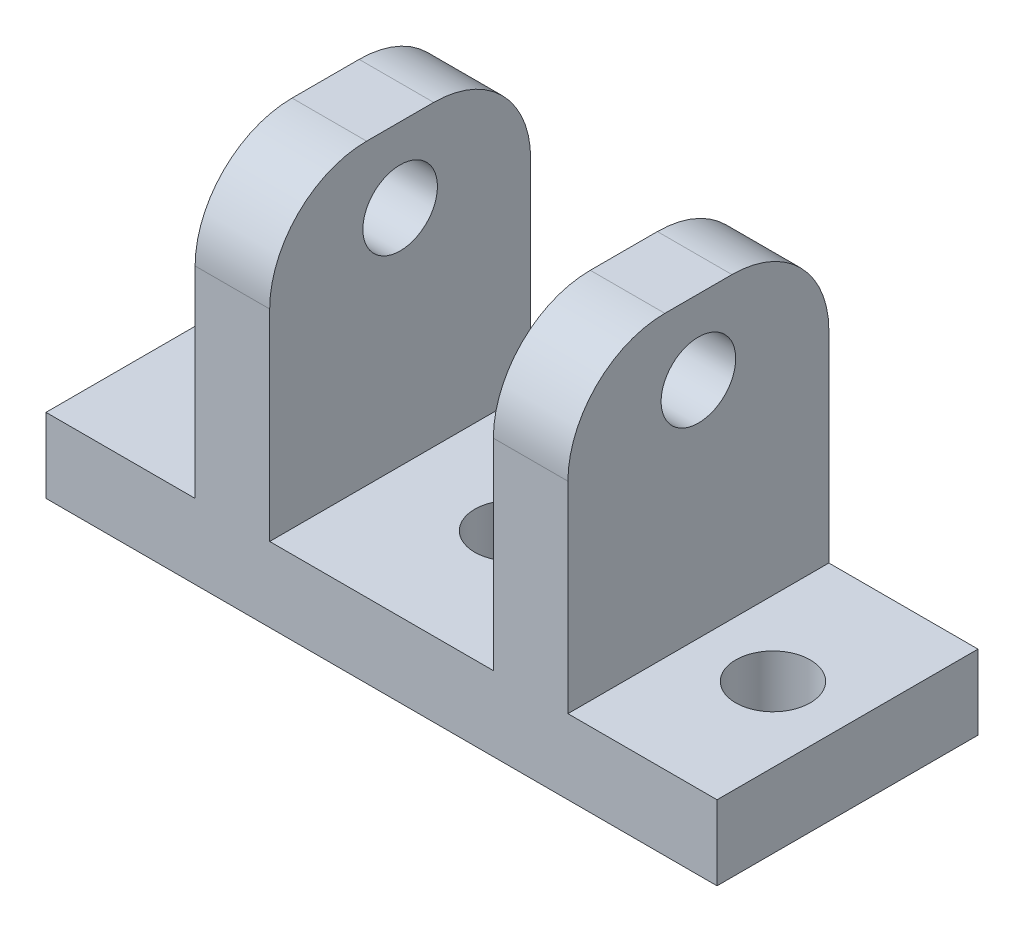
ISO-10303-21;
HEADER;
FILE_DESCRIPTION(('STEP AP214'),'2;1');
FILE_NAME('part.step','',(''),(''),'','','');
FILE_SCHEMA(('AUTOMOTIVE_DESIGN { 1 0 10303 214 1 1 1 1 }'));
ENDSEC;
DATA;
#1=APPLICATION_CONTEXT('core data for automotive mechanical design processes');
#2=APPLICATION_PROTOCOL_DEFINITION('international standard','automotive_design',2000,#1);
#3=PRODUCT_CONTEXT('',#1,'mechanical');
#4=PRODUCT('Part','Part','',(#3));
#5=PRODUCT_RELATED_PRODUCT_CATEGORY('part','',(#4));
#6=PRODUCT_DEFINITION_FORMATION('','',#4);
#7=PRODUCT_DEFINITION_CONTEXT('part definition',#1,'design');
#8=PRODUCT_DEFINITION('design','',#6,#7);
#9=PRODUCT_DEFINITION_SHAPE('','',#8);
#10=(LENGTH_UNIT() NAMED_UNIT(*) SI_UNIT(.MILLI.,.METRE.));
#11=(NAMED_UNIT(*) PLANE_ANGLE_UNIT() SI_UNIT($,.RADIAN.));
#12=(NAMED_UNIT(*) SI_UNIT($,.STERADIAN.) SOLID_ANGLE_UNIT());
#13=UNCERTAINTY_MEASURE_WITH_UNIT(LENGTH_MEASURE(1.E-05),#10,'distance_accuracy_value','');
#14=(GEOMETRIC_REPRESENTATION_CONTEXT(3) GLOBAL_UNCERTAINTY_ASSIGNED_CONTEXT((#13)) GLOBAL_UNIT_ASSIGNED_CONTEXT((#10,
#11,#12)) REPRESENTATION_CONTEXT('',''));
#15=CARTESIAN_POINT('',(0.,0.,0.));
#16=DIRECTION('',(0.,0.,1.));
#17=DIRECTION('',(1.,0.,0.));
#18=AXIS2_PLACEMENT_3D('',#15,#16,#17);
#19=CARTESIAN_POINT('',(0.,6.35,-22.225));
#20=DIRECTION('',(0.,0.,-1.));
#21=DIRECTION('',(-1.,0.,0.));
#22=AXIS2_PLACEMENT_3D('',#19,#20,#21);
#23=PLANE('',#22);
#24=DIRECTION('',(0.,-1.,0.));
#25=VECTOR('',#24,1.);
#26=CARTESIAN_POINT('',(12.7,31.75,-22.225));
#27=LINE('',#26,#25);
#28=CARTESIAN_POINT('',(12.7,23.495,-22.225));
#29=VERTEX_POINT('',#28);
#30=CARTESIAN_POINT('',(12.7,6.35,-22.225));
#31=VERTEX_POINT('',#30);
#32=EDGE_CURVE('E199',#29,#31,#27,.T.);
#33=ORIENTED_EDGE('',*,*,#32,.F.);
#34=DIRECTION('',(1.,0.,0.));
#35=VECTOR('',#34,1.);
#36=CARTESIAN_POINT('',(0.,23.495,-22.225));
#37=LINE('',#36,#35);
#38=CARTESIAN_POINT('',(19.05,23.495,-22.225));
#39=VERTEX_POINT('',#38);
#40=EDGE_CURVE('E260',#29,#39,#37,.T.);
#41=ORIENTED_EDGE('',*,*,#40,.T.);
#42=DIRECTION('',(0.,-1.,0.));
#43=VECTOR('',#42,1.);
#44=CARTESIAN_POINT('',(19.05,31.75,-22.225));
#45=LINE('',#44,#43);
#46=CARTESIAN_POINT('',(19.05,6.35,-22.225));
#47=VERTEX_POINT('',#46);
#48=EDGE_CURVE('E202',#39,#47,#45,.T.);
#49=ORIENTED_EDGE('',*,*,#48,.T.);
#50=DIRECTION('',(1.,0.,0.));
#51=VECTOR('',#50,1.);
#52=CARTESIAN_POINT('',(0.,6.35,-22.225));
#53=LINE('',#52,#51);
#54=CARTESIAN_POINT('',(38.1,6.35,-22.225));
#55=VERTEX_POINT('',#54);
#56=EDGE_CURVE('E243',#47,#55,#53,.T.);
#57=ORIENTED_EDGE('',*,*,#56,.T.);
#58=DIRECTION('',(0.,-1.,0.));
#59=VECTOR('',#58,1.);
#60=CARTESIAN_POINT('',(38.1,31.75,-22.225));
#61=LINE('',#60,#59);
#62=CARTESIAN_POINT('',(38.1,23.495,-22.225));
#63=VERTEX_POINT('',#62);
#64=EDGE_CURVE('E288',#63,#55,#61,.T.);
#65=ORIENTED_EDGE('',*,*,#64,.F.);
#66=DIRECTION('',(1.,0.,0.));
#67=VECTOR('',#66,1.);
#68=CARTESIAN_POINT('',(0.,23.495,-22.225));
#69=LINE('',#68,#67);
#70=CARTESIAN_POINT('',(44.45,23.495,-22.225));
#71=VERTEX_POINT('',#70);
#72=EDGE_CURVE('E321',#63,#71,#69,.T.);
#73=ORIENTED_EDGE('',*,*,#72,.T.);
#74=DIRECTION('',(0.,-1.,0.));
#75=VECTOR('',#74,1.);
#76=CARTESIAN_POINT('',(44.45,31.75,-22.225));
#77=LINE('',#76,#75);
#78=CARTESIAN_POINT('',(44.45,6.35,-22.225));
#79=VERTEX_POINT('',#78);
#80=EDGE_CURVE('E326',#71,#79,#77,.T.);
#81=ORIENTED_EDGE('',*,*,#80,.T.);
#82=DIRECTION('',(1.,0.,0.));
#83=VECTOR('',#82,1.);
#84=CARTESIAN_POINT('',(0.,6.35,-22.225));
#85=LINE('',#84,#83);
#86=CARTESIAN_POINT('',(57.15,6.35,-22.225));
#87=VERTEX_POINT('',#86);
#88=EDGE_CURVE('E166',#79,#87,#85,.T.);
#89=ORIENTED_EDGE('',*,*,#88,.T.);
#90=DIRECTION('',(0.,-1.,0.));
#91=VECTOR('',#90,1.);
#92=CARTESIAN_POINT('',(57.15,6.35,-22.225));
#93=LINE('',#92,#91);
#94=CARTESIAN_POINT('',(57.15,0.,-22.225));
#95=VERTEX_POINT('',#94);
#96=EDGE_CURVE('E174',#87,#95,#93,.T.);
#97=ORIENTED_EDGE('',*,*,#96,.T.);
#98=DIRECTION('',(1.,0.,0.));
#99=VECTOR('',#98,1.);
#100=CARTESIAN_POINT('',(0.,0.,-22.225));
#101=LINE('',#100,#99);
#102=CARTESIAN_POINT('',(0.,0.,-22.225));
#103=VERTEX_POINT('',#102);
#104=EDGE_CURVE('E219',#103,#95,#101,.T.);
#105=ORIENTED_EDGE('',*,*,#104,.F.);
#106=DIRECTION('',(0.,-1.,0.));
#107=VECTOR('',#106,1.);
#108=CARTESIAN_POINT('',(0.,6.35,-22.225));
#109=LINE('',#108,#107);
#110=CARTESIAN_POINT('',(0.,6.35,-22.225));
#111=VERTEX_POINT('',#110);
#112=EDGE_CURVE('E227',#111,#103,#109,.T.);
#113=ORIENTED_EDGE('',*,*,#112,.F.);
#114=DIRECTION('',(1.,0.,0.));
#115=VECTOR('',#114,1.);
#116=CARTESIAN_POINT('',(0.,6.35,-22.225));
#117=LINE('',#116,#115);
#118=EDGE_CURVE('E216',#111,#31,#117,.T.);
#119=ORIENTED_EDGE('',*,*,#118,.T.);
#120=EDGE_LOOP('',(#33,#41,#49,#57,#65,#73,#81,#89,#97,#105,#113,#119));
#121=FACE_BOUND('',#120,.T.);
#122=ADVANCED_FACE('F37',(#121),#23,.T.);
#123=CARTESIAN_POINT('',(0.,6.35,0.));
#124=DIRECTION('',(-1.,0.,0.));
#125=DIRECTION('',(0.,0.,1.));
#126=AXIS2_PLACEMENT_3D('',#123,#124,#125);
#127=PLANE('',#126);
#128=DIRECTION('',(0.,0.,-1.));
#129=VECTOR('',#128,1.);
#130=CARTESIAN_POINT('',(0.,0.,0.));
#131=LINE('',#130,#129);
#132=CARTESIAN_POINT('',(0.,0.,0.));
#133=VERTEX_POINT('',#132);
#134=EDGE_CURVE('E442',#133,#103,#131,.T.);
#135=ORIENTED_EDGE('',*,*,#134,.F.);
#136=DIRECTION('',(0.,-1.,0.));
#137=VECTOR('',#136,1.);
#138=CARTESIAN_POINT('',(0.,6.35,0.));
#139=LINE('',#138,#137);
#140=CARTESIAN_POINT('',(0.,6.35,0.));
#141=VERTEX_POINT('',#140);
#142=EDGE_CURVE('E226',#141,#133,#139,.T.);
#143=ORIENTED_EDGE('',*,*,#142,.F.);
#144=DIRECTION('',(0.,0.,-1.));
#145=VECTOR('',#144,1.);
#146=CARTESIAN_POINT('',(0.,6.35,0.));
#147=LINE('',#146,#145);
#148=EDGE_CURVE('E212',#141,#111,#147,.T.);
#149=ORIENTED_EDGE('',*,*,#148,.T.);
#150=ORIENTED_EDGE('',*,*,#112,.T.);
#151=EDGE_LOOP('',(#135,#143,#149,#150));
#152=FACE_BOUND('',#151,.T.);
#153=ADVANCED_FACE('F363',(#152),#127,.T.);
#154=CARTESIAN_POINT('',(0.,6.35,0.));
#155=DIRECTION('',(0.,0.,-1.));
#156=DIRECTION('',(-1.,0.,0.));
#157=AXIS2_PLACEMENT_3D('',#154,#155,#156);
#158=PLANE('',#157);
#159=DIRECTION('',(0.,-1.,0.));
#160=VECTOR('',#159,1.);
#161=CARTESIAN_POINT('',(44.45,31.75,0.));
#162=LINE('',#161,#160);
#163=CARTESIAN_POINT('',(44.45,23.495,0.));
#164=VERTEX_POINT('',#163);
#165=CARTESIAN_POINT('',(44.45,6.35,0.));
#166=VERTEX_POINT('',#165);
#167=EDGE_CURVE('E149',#164,#166,#162,.T.);
#168=ORIENTED_EDGE('',*,*,#167,.F.);
#169=DIRECTION('',(1.,0.,0.));
#170=VECTOR('',#169,1.);
#171=CARTESIAN_POINT('',(38.1,23.495,0.));
#172=LINE('',#171,#170);
#173=CARTESIAN_POINT('',(38.1,23.495,0.));
#174=VERTEX_POINT('',#173);
#175=EDGE_CURVE('E11',#164,#174,#172,.F.);
#176=ORIENTED_EDGE('',*,*,#175,.T.);
#177=DIRECTION('',(0.,-1.,0.));
#178=VECTOR('',#177,1.);
#179=CARTESIAN_POINT('',(38.1,31.75,0.));
#180=LINE('',#179,#178);
#181=CARTESIAN_POINT('',(38.1,6.35,0.));
#182=VERTEX_POINT('',#181);
#183=EDGE_CURVE('E158',#174,#182,#180,.T.);
#184=ORIENTED_EDGE('',*,*,#183,.T.);
#185=DIRECTION('',(1.,0.,0.));
#186=VECTOR('',#185,1.);
#187=CARTESIAN_POINT('',(0.,6.35,0.));
#188=LINE('',#187,#186);
#189=CARTESIAN_POINT('',(19.05,6.35,0.));
#190=VERTEX_POINT('',#189);
#191=EDGE_CURVE('E242',#190,#182,#188,.T.);
#192=ORIENTED_EDGE('',*,*,#191,.F.);
#193=DIRECTION('',(0.,-1.,0.));
#194=VECTOR('',#193,1.);
#195=CARTESIAN_POINT('',(19.05,31.75,0.));
#196=LINE('',#195,#194);
#197=CARTESIAN_POINT('',(19.05,23.495,0.));
#198=VERTEX_POINT('',#197);
#199=EDGE_CURVE('E255',#198,#190,#196,.T.);
#200=ORIENTED_EDGE('',*,*,#199,.F.);
#201=DIRECTION('',(1.,0.,0.));
#202=VECTOR('',#201,1.);
#203=CARTESIAN_POINT('',(12.7,23.495,0.));
#204=LINE('',#203,#202);
#205=CARTESIAN_POINT('',(12.7,23.495,0.));
#206=VERTEX_POINT('',#205);
#207=EDGE_CURVE('E45',#198,#206,#204,.F.);
#208=ORIENTED_EDGE('',*,*,#207,.T.);
#209=DIRECTION('',(0.,-1.,0.));
#210=VECTOR('',#209,1.);
#211=CARTESIAN_POINT('',(12.7,31.75,0.));
#212=LINE('',#211,#210);
#213=CARTESIAN_POINT('',(12.7,6.35,0.));
#214=VERTEX_POINT('',#213);
#215=EDGE_CURVE('E203',#206,#214,#212,.T.);
#216=ORIENTED_EDGE('',*,*,#215,.T.);
#217=DIRECTION('',(1.,0.,0.));
#218=VECTOR('',#217,1.);
#219=CARTESIAN_POINT('',(0.,6.35,0.));
#220=LINE('',#219,#218);
#221=EDGE_CURVE('E215',#141,#214,#220,.T.);
#222=ORIENTED_EDGE('',*,*,#221,.F.);
#223=ORIENTED_EDGE('',*,*,#142,.T.);
#224=DIRECTION('',(1.,0.,0.));
#225=VECTOR('',#224,1.);
#226=CARTESIAN_POINT('',(0.,0.,0.));
#227=LINE('',#226,#225);
#228=CARTESIAN_POINT('',(57.15,0.,0.));
#229=VERTEX_POINT('',#228);
#230=EDGE_CURVE('E235',#133,#229,#227,.T.);
#231=ORIENTED_EDGE('',*,*,#230,.T.);
#232=DIRECTION('',(0.,-1.,0.));
#233=VECTOR('',#232,1.);
#234=CARTESIAN_POINT('',(57.15,6.35,0.));
#235=LINE('',#234,#233);
#236=CARTESIAN_POINT('',(57.15,6.35,0.));
#237=VERTEX_POINT('',#236);
#238=EDGE_CURVE('E170',#237,#229,#235,.T.);
#239=ORIENTED_EDGE('',*,*,#238,.F.);
#240=DIRECTION('',(1.,0.,0.));
#241=VECTOR('',#240,1.);
#242=CARTESIAN_POINT('',(0.,6.35,0.));
#243=LINE('',#242,#241);
#244=EDGE_CURVE('E163',#166,#237,#243,.T.);
#245=ORIENTED_EDGE('',*,*,#244,.F.);
#246=EDGE_LOOP('',(#168,#176,#184,#192,#200,#208,#216,#222,#223,#231,#239,#245));
#247=FACE_BOUND('',#246,.T.);
#248=ADVANCED_FACE('F168',(#247),#158,.F.);
#249=CARTESIAN_POINT('',(0.,6.35,0.));
#250=DIRECTION('',(0.,1.,0.));
#251=DIRECTION('',(0.,0.,1.));
#252=AXIS2_PLACEMENT_3D('',#249,#250,#251);
#253=PLANE('',#252);
#254=CARTESIAN_POINT('',(6.35,6.35,-11.1125));
#255=DIRECTION('',(0.,1.,0.));
#256=DIRECTION('',(0.,0.,1.));
#257=AXIS2_PLACEMENT_3D('',#254,#255,#256);
#258=CIRCLE('',#257,3.17499999999999);
#259=CARTESIAN_POINT('',(6.35,6.35,-7.93750000000001));
#260=VERTEX_POINT('',#259);
#261=EDGE_CURVE('E198',#260,#260,#258,.T.);
#262=ORIENTED_EDGE('',*,*,#261,.F.);
#263=EDGE_LOOP('',(#262));
#264=FACE_BOUND('',#263,.T.);
#265=ORIENTED_EDGE('',*,*,#118,.F.);
#266=ORIENTED_EDGE('',*,*,#148,.F.);
#267=ORIENTED_EDGE('',*,*,#221,.T.);
#268=DIRECTION('',(0.,0.,1.));
#269=VECTOR('',#268,1.);
#270=CARTESIAN_POINT('',(12.7,6.35,0.));
#271=LINE('',#270,#269);
#272=EDGE_CURVE('E222',#31,#214,#271,.T.);
#273=ORIENTED_EDGE('',*,*,#272,.F.);
#274=EDGE_LOOP('',(#265,#266,#267,#273));
#275=FACE_BOUND('',#274,.T.);
#276=ADVANCED_FACE('F373',(#264,#275),#253,.T.);
#277=CARTESIAN_POINT('',(0.,0.,0.));
#278=DIRECTION('',(0.,1.,0.));
#279=DIRECTION('',(0.,0.,1.));
#280=AXIS2_PLACEMENT_3D('',#277,#278,#279);
#281=PLANE('',#280);
#282=CARTESIAN_POINT('',(6.35,0.,-11.1125));
#283=DIRECTION('',(0.,1.,0.));
#284=DIRECTION('',(0.,0.,1.));
#285=AXIS2_PLACEMENT_3D('',#282,#283,#284);
#286=CIRCLE('',#285,3.17499999999999);
#287=CARTESIAN_POINT('',(6.35,0.,-7.93750000000001));
#288=VERTEX_POINT('',#287);
#289=EDGE_CURVE('E195',#288,#288,#286,.T.);
#290=ORIENTED_EDGE('',*,*,#289,.T.);
#291=EDGE_LOOP('',(#290));
#292=FACE_BOUND('',#291,.T.);
#293=CARTESIAN_POINT('',(28.575,0.,-11.1125));
#294=DIRECTION('',(0.,1.,0.));
#295=DIRECTION('',(0.,0.,1.));
#296=AXIS2_PLACEMENT_3D('',#293,#294,#295);
#297=CIRCLE('',#296,3.17499999999999);
#298=CARTESIAN_POINT('',(28.575,0.,-7.93750000000001));
#299=VERTEX_POINT('',#298);
#300=EDGE_CURVE('E190',#299,#299,#297,.T.);
#301=ORIENTED_EDGE('',*,*,#300,.T.);
#302=EDGE_LOOP('',(#301));
#303=FACE_BOUND('',#302,.T.);
#304=CARTESIAN_POINT('',(50.8,0.,-11.1125));
#305=DIRECTION('',(0.,1.,0.));
#306=DIRECTION('',(0.,0.,1.));
#307=AXIS2_PLACEMENT_3D('',#304,#305,#306);
#308=CIRCLE('',#307,3.17499999999999);
#309=CARTESIAN_POINT('',(50.8,0.,-7.93750000000001));
#310=VERTEX_POINT('',#309);
#311=EDGE_CURVE('E434',#310,#310,#308,.T.);
#312=ORIENTED_EDGE('',*,*,#311,.T.);
#313=EDGE_LOOP('',(#312));
#314=FACE_BOUND('',#313,.T.);
#315=ORIENTED_EDGE('',*,*,#104,.T.);
#316=DIRECTION('',(0.,0.,-1.));
#317=VECTOR('',#316,1.);
#318=CARTESIAN_POINT('',(57.15,0.,0.));
#319=LINE('',#318,#317);
#320=EDGE_CURVE('E182',#229,#95,#319,.T.);
#321=ORIENTED_EDGE('',*,*,#320,.F.);
#322=ORIENTED_EDGE('',*,*,#230,.F.);
#323=ORIENTED_EDGE('',*,*,#134,.T.);
#324=EDGE_LOOP('',(#315,#321,#322,#323));
#325=FACE_BOUND('',#324,.T.);
#326=ADVANCED_FACE('F374',(#292,#303,#314,#325),#281,.F.);
#327=CARTESIAN_POINT('',(12.7,31.75,0.));
#328=DIRECTION('',(1.,0.,0.));
#329=DIRECTION('',(0.,0.,-1.));
#330=AXIS2_PLACEMENT_3D('',#327,#328,#329);
#331=PLANE('',#330);
#332=CARTESIAN_POINT('',(12.7,25.4,-11.1125));
#333=DIRECTION('',(-1.,0.,0.));
#334=DIRECTION('',(0.,0.,1.));
#335=AXIS2_PLACEMENT_3D('',#332,#333,#334);
#336=CIRCLE('',#335,3.175);
#337=CARTESIAN_POINT('',(12.7,25.4,-7.9375));
#338=VERTEX_POINT('',#337);
#339=EDGE_CURVE('E189',#338,#338,#336,.T.);
#340=ORIENTED_EDGE('',*,*,#339,.F.);
#341=EDGE_LOOP('',(#340));
#342=FACE_BOUND('',#341,.T.);
#343=DIRECTION('',(0.,0.,1.));
#344=VECTOR('',#343,1.);
#345=CARTESIAN_POINT('',(12.7,31.75,0.));
#346=LINE('',#345,#344);
#347=CARTESIAN_POINT('',(12.7,31.75,-13.97));
#348=VERTEX_POINT('',#347);
#349=CARTESIAN_POINT('',(12.7,31.75,-8.255));
#350=VERTEX_POINT('',#349);
#351=EDGE_CURVE('E253',#348,#350,#346,.T.);
#352=ORIENTED_EDGE('',*,*,#351,.F.);
#353=CARTESIAN_POINT('',(12.7,23.495,-13.97));
#354=DIRECTION('',(1.,0.,0.));
#355=DIRECTION('',(0.,0.,-1.));
#356=AXIS2_PLACEMENT_3D('',#353,#354,#355);
#357=CIRCLE('',#356,8.255);
#358=EDGE_CURVE('E274',#348,#29,#357,.F.);
#359=ORIENTED_EDGE('',*,*,#358,.T.);
#360=ORIENTED_EDGE('',*,*,#32,.T.);
#361=ORIENTED_EDGE('',*,*,#272,.T.);
#362=ORIENTED_EDGE('',*,*,#215,.F.);
#363=CARTESIAN_POINT('',(12.7,23.495,-8.255));
#364=DIRECTION('',(1.,0.,0.));
#365=DIRECTION('',(0.,0.,-1.));
#366=AXIS2_PLACEMENT_3D('',#363,#364,#365);
#367=CIRCLE('',#366,8.255);
#368=EDGE_CURVE('E271',#206,#350,#367,.F.);
#369=ORIENTED_EDGE('',*,*,#368,.T.);
#370=EDGE_LOOP('',(#352,#359,#360,#361,#362,#369));
#371=FACE_BOUND('',#370,.T.);
#372=ADVANCED_FACE('F302',(#342,#371),#331,.F.);
#373=CARTESIAN_POINT('',(19.05,31.75,0.));
#374=DIRECTION('',(1.,0.,0.));
#375=DIRECTION('',(0.,0.,-1.));
#376=AXIS2_PLACEMENT_3D('',#373,#374,#375);
#377=PLANE('',#376);
#378=CARTESIAN_POINT('',(19.05,25.4,-11.1125));
#379=DIRECTION('',(1.,0.,0.));
#380=DIRECTION('',(0.,0.,-1.));
#381=AXIS2_PLACEMENT_3D('',#378,#379,#380);
#382=CIRCLE('',#381,3.175);
#383=CARTESIAN_POINT('',(19.05,25.4,-14.2875));
#384=VERTEX_POINT('',#383);
#385=EDGE_CURVE('E445',#384,#384,#382,.T.);
#386=ORIENTED_EDGE('',*,*,#385,.F.);
#387=EDGE_LOOP('',(#386));
#388=FACE_BOUND('',#387,.T.);
#389=ORIENTED_EDGE('',*,*,#48,.F.);
#390=CARTESIAN_POINT('',(19.05,23.495,-13.97));
#391=DIRECTION('',(1.,0.,0.));
#392=DIRECTION('',(0.,0.,-1.));
#393=AXIS2_PLACEMENT_3D('',#390,#391,#392);
#394=CIRCLE('',#393,8.255);
#395=CARTESIAN_POINT('',(19.05,31.75,-13.97));
#396=VERTEX_POINT('',#395);
#397=EDGE_CURVE('E264',#39,#396,#394,.T.);
#398=ORIENTED_EDGE('',*,*,#397,.T.);
#399=DIRECTION('',(0.,0.,1.));
#400=VECTOR('',#399,1.);
#401=CARTESIAN_POINT('',(19.05,31.75,0.));
#402=LINE('',#401,#400);
#403=CARTESIAN_POINT('',(19.05,31.75,-8.255));
#404=VERTEX_POINT('',#403);
#405=EDGE_CURVE('E250',#396,#404,#402,.T.);
#406=ORIENTED_EDGE('',*,*,#405,.T.);
#407=CARTESIAN_POINT('',(19.05,23.495,-8.255));
#408=DIRECTION('',(1.,0.,0.));
#409=DIRECTION('',(0.,0.,-1.));
#410=AXIS2_PLACEMENT_3D('',#407,#408,#409);
#411=CIRCLE('',#410,8.255);
#412=EDGE_CURVE('E262',#404,#198,#411,.T.);
#413=ORIENTED_EDGE('',*,*,#412,.T.);
#414=ORIENTED_EDGE('',*,*,#199,.T.);
#415=DIRECTION('',(0.,0.,1.));
#416=VECTOR('',#415,1.);
#417=CARTESIAN_POINT('',(19.05,6.35,0.));
#418=LINE('',#417,#416);
#419=EDGE_CURVE('E238',#47,#190,#418,.T.);
#420=ORIENTED_EDGE('',*,*,#419,.F.);
#421=EDGE_LOOP('',(#389,#398,#406,#413,#414,#420));
#422=FACE_BOUND('',#421,.T.);
#423=ADVANCED_FACE('F311',(#388,#422),#377,.T.);
#424=CARTESIAN_POINT('',(0.,31.75,0.));
#425=DIRECTION('',(0.,1.,0.));
#426=DIRECTION('',(0.,0.,1.));
#427=AXIS2_PLACEMENT_3D('',#424,#425,#426);
#428=PLANE('',#427);
#429=ORIENTED_EDGE('',*,*,#405,.F.);
#430=DIRECTION('',(1.,0.,0.));
#431=VECTOR('',#430,1.);
#432=CARTESIAN_POINT('',(0.,31.75,-13.97));
#433=LINE('',#432,#431);
#434=EDGE_CURVE('E269',#396,#348,#433,.F.);
#435=ORIENTED_EDGE('',*,*,#434,.T.);
#436=ORIENTED_EDGE('',*,*,#351,.T.);
#437=DIRECTION('',(1.,0.,0.));
#438=VECTOR('',#437,1.);
#439=CARTESIAN_POINT('',(19.05,31.75,-8.255));
#440=LINE('',#439,#438);
#441=EDGE_CURVE('E266',#350,#404,#440,.T.);
#442=ORIENTED_EDGE('',*,*,#441,.T.);
#443=EDGE_LOOP('',(#429,#435,#436,#442));
#444=FACE_BOUND('',#443,.T.);
#445=ADVANCED_FACE('F307',(#444),#428,.T.);
#446=CARTESIAN_POINT('',(0.,6.35,0.));
#447=DIRECTION('',(0.,1.,0.));
#448=DIRECTION('',(0.,0.,1.));
#449=AXIS2_PLACEMENT_3D('',#446,#447,#448);
#450=PLANE('',#449);
#451=CARTESIAN_POINT('',(28.575,6.35,-11.1125));
#452=DIRECTION('',(0.,1.,0.));
#453=DIRECTION('',(0.,0.,1.));
#454=AXIS2_PLACEMENT_3D('',#451,#452,#453);
#455=CIRCLE('',#454,3.17499999999999);
#456=CARTESIAN_POINT('',(28.575,6.35,-7.93750000000001));
#457=VERTEX_POINT('',#456);
#458=EDGE_CURVE('E194',#457,#457,#455,.T.);
#459=ORIENTED_EDGE('',*,*,#458,.F.);
#460=EDGE_LOOP('',(#459));
#461=FACE_BOUND('',#460,.T.);
#462=DIRECTION('',(0.,0.,1.));
#463=VECTOR('',#462,1.);
#464=CARTESIAN_POINT('',(38.1,6.35,0.));
#465=LINE('',#464,#463);
#466=EDGE_CURVE('E327',#55,#182,#465,.T.);
#467=ORIENTED_EDGE('',*,*,#466,.F.);
#468=ORIENTED_EDGE('',*,*,#56,.F.);
#469=ORIENTED_EDGE('',*,*,#419,.T.);
#470=ORIENTED_EDGE('',*,*,#191,.T.);
#471=EDGE_LOOP('',(#467,#468,#469,#470));
#472=FACE_BOUND('',#471,.T.);
#473=ADVANCED_FACE('F336',(#461,#472),#450,.T.);
#474=CARTESIAN_POINT('',(38.1,31.75,0.));
#475=DIRECTION('',(1.,0.,0.));
#476=DIRECTION('',(0.,0.,-1.));
#477=AXIS2_PLACEMENT_3D('',#474,#475,#476);
#478=PLANE('',#477);
#479=CARTESIAN_POINT('',(38.1,25.4,-11.1125));
#480=DIRECTION('',(1.,0.,0.));
#481=DIRECTION('',(0.,0.,-1.));
#482=AXIS2_PLACEMENT_3D('',#479,#480,#481);
#483=CIRCLE('',#482,3.175);
#484=CARTESIAN_POINT('',(38.1,25.4,-14.2875));
#485=VERTEX_POINT('',#484);
#486=EDGE_CURVE('E188',#485,#485,#483,.T.);
#487=ORIENTED_EDGE('',*,*,#486,.T.);
#488=EDGE_LOOP('',(#487));
#489=FACE_BOUND('',#488,.T.);
#490=DIRECTION('',(0.,0.,1.));
#491=VECTOR('',#490,1.);
#492=CARTESIAN_POINT('',(38.1,31.75,0.));
#493=LINE('',#492,#491);
#494=CARTESIAN_POINT('',(38.1,31.75,-13.97));
#495=VERTEX_POINT('',#494);
#496=CARTESIAN_POINT('',(38.1,31.75,-8.255));
#497=VERTEX_POINT('',#496);
#498=EDGE_CURVE('E159',#495,#497,#493,.T.);
#499=ORIENTED_EDGE('',*,*,#498,.F.);
#500=CARTESIAN_POINT('',(38.1,23.495,-13.97));
#501=DIRECTION('',(1.,0.,0.));
#502=DIRECTION('',(0.,0.,-1.));
#503=AXIS2_PLACEMENT_3D('',#500,#501,#502);
#504=CIRCLE('',#503,8.255);
#505=EDGE_CURVE('E292',#495,#63,#504,.F.);
#506=ORIENTED_EDGE('',*,*,#505,.T.);
#507=ORIENTED_EDGE('',*,*,#64,.T.);
#508=ORIENTED_EDGE('',*,*,#466,.T.);
#509=ORIENTED_EDGE('',*,*,#183,.F.);
#510=CARTESIAN_POINT('',(38.1,23.495,-8.255));
#511=DIRECTION('',(1.,0.,0.));
#512=DIRECTION('',(0.,0.,-1.));
#513=AXIS2_PLACEMENT_3D('',#510,#511,#512);
#514=CIRCLE('',#513,8.255);
#515=EDGE_CURVE('E57',#174,#497,#514,.F.);
#516=ORIENTED_EDGE('',*,*,#515,.T.);
#517=EDGE_LOOP('',(#499,#506,#507,#508,#509,#516));
#518=FACE_BOUND('',#517,.T.);
#519=ADVANCED_FACE('F331',(#489,#518),#478,.F.);
#520=CARTESIAN_POINT('',(44.45,31.75,0.));
#521=DIRECTION('',(1.,0.,0.));
#522=DIRECTION('',(0.,0.,-1.));
#523=AXIS2_PLACEMENT_3D('',#520,#521,#522);
#524=PLANE('',#523);
#525=CARTESIAN_POINT('',(44.45,25.4,-11.1125));
#526=DIRECTION('',(1.,0.,0.));
#527=DIRECTION('',(0.,0.,-1.));
#528=AXIS2_PLACEMENT_3D('',#525,#526,#527);
#529=CIRCLE('',#528,3.175);
#530=CARTESIAN_POINT('',(44.45,25.4,-14.2875));
#531=VERTEX_POINT('',#530);
#532=EDGE_CURVE('E185',#531,#531,#529,.T.);
#533=ORIENTED_EDGE('',*,*,#532,.F.);
#534=EDGE_LOOP('',(#533));
#535=FACE_BOUND('',#534,.T.);
#536=ORIENTED_EDGE('',*,*,#80,.F.);
#537=CARTESIAN_POINT('',(44.45,23.495,-13.97));
#538=DIRECTION('',(1.,0.,0.));
#539=DIRECTION('',(0.,0.,-1.));
#540=AXIS2_PLACEMENT_3D('',#537,#538,#539);
#541=CIRCLE('',#540,8.255);
#542=CARTESIAN_POINT('',(44.45,31.75,-13.97));
#543=VERTEX_POINT('',#542);
#544=EDGE_CURVE('E348',#71,#543,#541,.T.);
#545=ORIENTED_EDGE('',*,*,#544,.T.);
#546=DIRECTION('',(0.,0.,1.));
#547=VECTOR('',#546,1.);
#548=CARTESIAN_POINT('',(44.45,31.75,0.));
#549=LINE('',#548,#547);
#550=CARTESIAN_POINT('',(44.45,31.75,-8.255));
#551=VERTEX_POINT('',#550);
#552=EDGE_CURVE('E349',#543,#551,#549,.T.);
#553=ORIENTED_EDGE('',*,*,#552,.T.);
#554=CARTESIAN_POINT('',(44.45,23.495,-8.255));
#555=DIRECTION('',(1.,0.,0.));
#556=DIRECTION('',(0.,0.,-1.));
#557=AXIS2_PLACEMENT_3D('',#554,#555,#556);
#558=CIRCLE('',#557,8.255);
#559=EDGE_CURVE('E156',#551,#164,#558,.T.);
#560=ORIENTED_EDGE('',*,*,#559,.T.);
#561=ORIENTED_EDGE('',*,*,#167,.T.);
#562=DIRECTION('',(0.,0.,1.));
#563=VECTOR('',#562,1.);
#564=CARTESIAN_POINT('',(44.45,6.35,0.));
#565=LINE('',#564,#563);
#566=EDGE_CURVE('E153',#79,#166,#565,.T.);
#567=ORIENTED_EDGE('',*,*,#566,.F.);
#568=EDGE_LOOP('',(#536,#545,#553,#560,#561,#567));
#569=FACE_BOUND('',#568,.T.);
#570=ADVANCED_FACE('F152',(#535,#569),#524,.T.);
#571=CARTESIAN_POINT('',(0.,31.75,0.));
#572=DIRECTION('',(0.,1.,0.));
#573=DIRECTION('',(0.,0.,1.));
#574=AXIS2_PLACEMENT_3D('',#571,#572,#573);
#575=PLANE('',#574);
#576=ORIENTED_EDGE('',*,*,#552,.F.);
#577=DIRECTION('',(1.,0.,0.));
#578=VECTOR('',#577,1.);
#579=CARTESIAN_POINT('',(0.,31.75,-13.97));
#580=LINE('',#579,#578);
#581=EDGE_CURVE('E289',#543,#495,#580,.F.);
#582=ORIENTED_EDGE('',*,*,#581,.T.);
#583=ORIENTED_EDGE('',*,*,#498,.T.);
#584=DIRECTION('',(1.,0.,0.));
#585=VECTOR('',#584,1.);
#586=CARTESIAN_POINT('',(44.45,31.75,-8.255));
#587=LINE('',#586,#585);
#588=EDGE_CURVE('E345',#497,#551,#587,.T.);
#589=ORIENTED_EDGE('',*,*,#588,.T.);
#590=EDGE_LOOP('',(#576,#582,#583,#589));
#591=FACE_BOUND('',#590,.T.);
#592=ADVANCED_FACE('F352',(#591),#575,.T.);
#593=CARTESIAN_POINT('',(57.15,6.35,0.));
#594=DIRECTION('',(-1.,0.,0.));
#595=DIRECTION('',(0.,0.,1.));
#596=AXIS2_PLACEMENT_3D('',#593,#594,#595);
#597=PLANE('',#596);
#598=ORIENTED_EDGE('',*,*,#320,.T.);
#599=ORIENTED_EDGE('',*,*,#96,.F.);
#600=DIRECTION('',(0.,0.,-1.));
#601=VECTOR('',#600,1.);
#602=CARTESIAN_POINT('',(57.15,6.35,0.));
#603=LINE('',#602,#601);
#604=EDGE_CURVE('E172',#237,#87,#603,.T.);
#605=ORIENTED_EDGE('',*,*,#604,.F.);
#606=ORIENTED_EDGE('',*,*,#238,.T.);
#607=EDGE_LOOP('',(#598,#599,#605,#606));
#608=FACE_BOUND('',#607,.T.);
#609=ADVANCED_FACE('F400',(#608),#597,.F.);
#610=CARTESIAN_POINT('',(0.,6.35,0.));
#611=DIRECTION('',(0.,1.,0.));
#612=DIRECTION('',(0.,0.,1.));
#613=AXIS2_PLACEMENT_3D('',#610,#611,#612);
#614=PLANE('',#613);
#615=CARTESIAN_POINT('',(50.8,6.35,-11.1125));
#616=DIRECTION('',(0.,1.,0.));
#617=DIRECTION('',(0.,0.,1.));
#618=AXIS2_PLACEMENT_3D('',#615,#616,#617);
#619=CIRCLE('',#618,3.17499999999999);
#620=CARTESIAN_POINT('',(50.8,6.35,-7.93750000000001));
#621=VERTEX_POINT('',#620);
#622=EDGE_CURVE('E193',#621,#621,#619,.T.);
#623=ORIENTED_EDGE('',*,*,#622,.F.);
#624=EDGE_LOOP('',(#623));
#625=FACE_BOUND('',#624,.T.);
#626=ORIENTED_EDGE('',*,*,#88,.F.);
#627=ORIENTED_EDGE('',*,*,#566,.T.);
#628=ORIENTED_EDGE('',*,*,#244,.T.);
#629=ORIENTED_EDGE('',*,*,#604,.T.);
#630=EDGE_LOOP('',(#626,#627,#628,#629));
#631=FACE_BOUND('',#630,.T.);
#632=ADVANCED_FACE('F162',(#625,#631),#614,.T.);
#633=CARTESIAN_POINT('',(57.150025,25.4,-11.1125));
#634=DIRECTION('',(-1.,0.,0.));
#635=DIRECTION('',(0.,0.,1.));
#636=AXIS2_PLACEMENT_3D('',#633,#634,#635);
#637=CYLINDRICAL_SURFACE('',#636,3.175);
#638=ORIENTED_EDGE('',*,*,#532,.T.);
#639=EDGE_LOOP('',(#638));
#640=FACE_BOUND('',#639,.T.);
#641=ORIENTED_EDGE('',*,*,#486,.F.);
#642=EDGE_LOOP('',(#641));
#643=FACE_BOUND('',#642,.T.);
#644=ADVANCED_FACE('F406',(#640,#643),#637,.F.);
#645=ORIENTED_EDGE('',*,*,#385,.T.);
#646=EDGE_LOOP('',(#645));
#647=FACE_BOUND('',#646,.T.);
#648=ORIENTED_EDGE('',*,*,#339,.T.);
#649=EDGE_LOOP('',(#648));
#650=FACE_BOUND('',#649,.T.);
#651=ADVANCED_FACE('F408',(#647,#650),#637,.F.);
#652=CARTESIAN_POINT('',(50.8,6.35,-11.1125));
#653=DIRECTION('',(0.,1.,0.));
#654=DIRECTION('',(0.,0.,1.));
#655=AXIS2_PLACEMENT_3D('',#652,#653,#654);
#656=CYLINDRICAL_SURFACE('',#655,3.17499999999999);
#657=ORIENTED_EDGE('',*,*,#622,.T.);
#658=EDGE_LOOP('',(#657));
#659=FACE_BOUND('',#658,.T.);
#660=ORIENTED_EDGE('',*,*,#311,.F.);
#661=EDGE_LOOP('',(#660));
#662=FACE_BOUND('',#661,.T.);
#663=ADVANCED_FACE('F411',(#659,#662),#656,.F.);
#664=CARTESIAN_POINT('',(28.575,6.35,-11.1125));
#665=DIRECTION('',(0.,1.,0.));
#666=DIRECTION('',(0.,0.,1.));
#667=AXIS2_PLACEMENT_3D('',#664,#665,#666);
#668=CYLINDRICAL_SURFACE('',#667,3.17499999999999);
#669=ORIENTED_EDGE('',*,*,#458,.T.);
#670=EDGE_LOOP('',(#669));
#671=FACE_BOUND('',#670,.T.);
#672=ORIENTED_EDGE('',*,*,#300,.F.);
#673=EDGE_LOOP('',(#672));
#674=FACE_BOUND('',#673,.T.);
#675=ADVANCED_FACE('F415',(#671,#674),#668,.F.);
#676=CARTESIAN_POINT('',(6.35,6.35,-11.1125));
#677=DIRECTION('',(0.,1.,0.));
#678=DIRECTION('',(0.,0.,1.));
#679=AXIS2_PLACEMENT_3D('',#676,#677,#678);
#680=CYLINDRICAL_SURFACE('',#679,3.17499999999999);
#681=ORIENTED_EDGE('',*,*,#261,.T.);
#682=EDGE_LOOP('',(#681));
#683=FACE_BOUND('',#682,.T.);
#684=ORIENTED_EDGE('',*,*,#289,.F.);
#685=EDGE_LOOP('',(#684));
#686=FACE_BOUND('',#685,.T.);
#687=ADVANCED_FACE('F360',(#683,#686),#680,.F.);
#688=CARTESIAN_POINT('',(0.,23.495,-13.97));
#689=DIRECTION('',(1.,0.,0.));
#690=DIRECTION('',(0.,0.,-1.));
#691=AXIS2_PLACEMENT_3D('',#688,#689,#690);
#692=CYLINDRICAL_SURFACE('',#691,8.255);
#693=ORIENTED_EDGE('',*,*,#358,.F.);
#694=ORIENTED_EDGE('',*,*,#434,.F.);
#695=ORIENTED_EDGE('',*,*,#397,.F.);
#696=ORIENTED_EDGE('',*,*,#40,.F.);
#697=EDGE_LOOP('',(#693,#694,#695,#696));
#698=FACE_BOUND('',#697,.T.);
#699=ADVANCED_FACE('F317',(#698),#692,.T.);
#700=CARTESIAN_POINT('',(0.,23.495,-13.97));
#701=DIRECTION('',(1.,0.,0.));
#702=DIRECTION('',(0.,0.,-1.));
#703=AXIS2_PLACEMENT_3D('',#700,#701,#702);
#704=CYLINDRICAL_SURFACE('',#703,8.255);
#705=ORIENTED_EDGE('',*,*,#505,.F.);
#706=ORIENTED_EDGE('',*,*,#581,.F.);
#707=ORIENTED_EDGE('',*,*,#544,.F.);
#708=ORIENTED_EDGE('',*,*,#72,.F.);
#709=EDGE_LOOP('',(#705,#706,#707,#708));
#710=FACE_BOUND('',#709,.T.);
#711=ADVANCED_FACE('F353',(#710),#704,.T.);
#712=CARTESIAN_POINT('',(0.,23.495,-8.255));
#713=DIRECTION('',(-1.,0.,0.));
#714=DIRECTION('',(0.,0.,1.));
#715=AXIS2_PLACEMENT_3D('',#712,#713,#714);
#716=CYLINDRICAL_SURFACE('',#715,8.255);
#717=ORIENTED_EDGE('',*,*,#515,.F.);
#718=ORIENTED_EDGE('',*,*,#175,.F.);
#719=ORIENTED_EDGE('',*,*,#559,.F.);
#720=ORIENTED_EDGE('',*,*,#588,.F.);
#721=EDGE_LOOP('',(#717,#718,#719,#720));
#722=FACE_BOUND('',#721,.T.);
#723=ADVANCED_FACE('F343',(#722),#716,.T.);
#724=CARTESIAN_POINT('',(0.,23.495,-8.255));
#725=DIRECTION('',(-1.,0.,0.));
#726=DIRECTION('',(0.,0.,1.));
#727=AXIS2_PLACEMENT_3D('',#724,#725,#726);
#728=CYLINDRICAL_SURFACE('',#727,8.255);
#729=ORIENTED_EDGE('',*,*,#368,.F.);
#730=ORIENTED_EDGE('',*,*,#207,.F.);
#731=ORIENTED_EDGE('',*,*,#412,.F.);
#732=ORIENTED_EDGE('',*,*,#441,.F.);
#733=EDGE_LOOP('',(#729,#730,#731,#732));
#734=FACE_BOUND('',#733,.T.);
#735=ADVANCED_FACE('F39',(#734),#728,.T.);
#736=CLOSED_SHELL('',(#122,#153,#248,#276,#326,#372,#423,#445,#473,#519,#570,#592,#609,#632,
#644,#651,#663,#675,#687,#699,#711,#723,#735));
#737=MANIFOLD_SOLID_BREP('B2',#736);
#738=ADVANCED_BREP_SHAPE_REPRESENTATION('',(#18,#737),#14);
#739=SHAPE_DEFINITION_REPRESENTATION(#9,#738);
ENDSEC;
END-ISO-10303-21;
